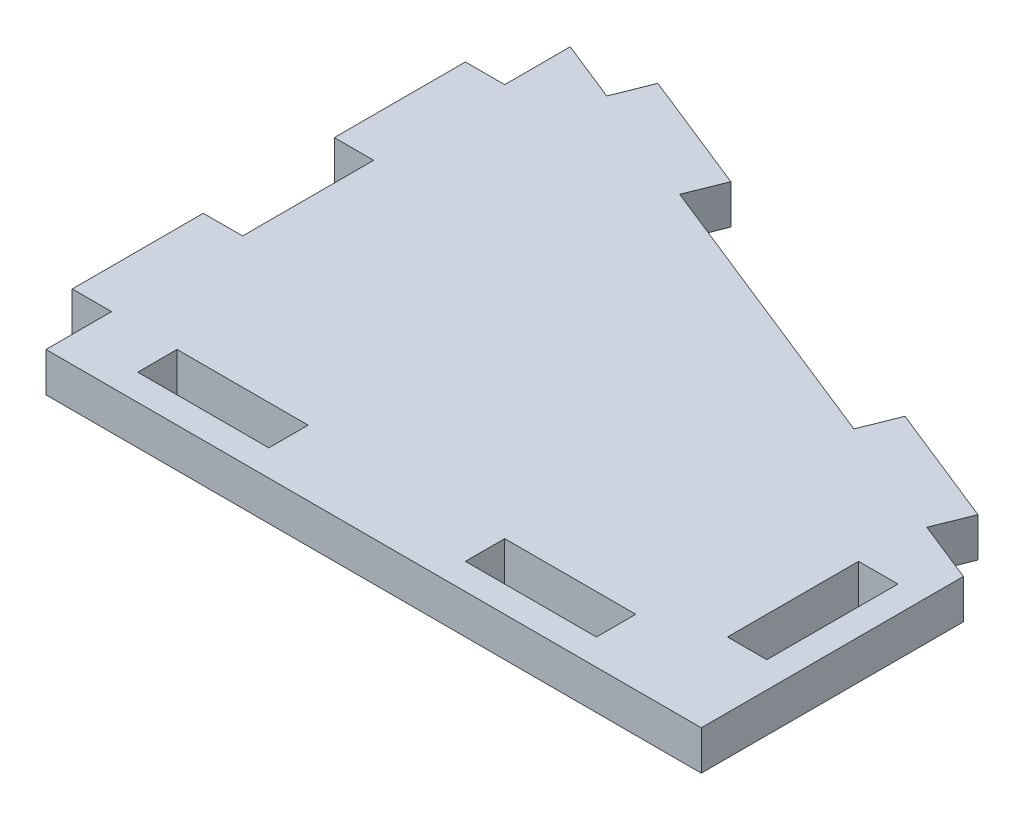
ISO-10303-21;
HEADER;
FILE_DESCRIPTION(('STEP AP214'),'2;1');
FILE_NAME('part.step','',(''),(''),'','','');
FILE_SCHEMA(('AUTOMOTIVE_DESIGN { 1 0 10303 214 1 1 1 1 }'));
ENDSEC;
DATA;
#1=APPLICATION_CONTEXT('core data for automotive mechanical design processes');
#2=APPLICATION_PROTOCOL_DEFINITION('international standard','automotive_design',2000,#1);
#3=PRODUCT_CONTEXT('',#1,'mechanical');
#4=PRODUCT('Part','Part','',(#3));
#5=PRODUCT_RELATED_PRODUCT_CATEGORY('part','',(#4));
#6=PRODUCT_DEFINITION_FORMATION('','',#4);
#7=PRODUCT_DEFINITION_CONTEXT('part definition',#1,'design');
#8=PRODUCT_DEFINITION('design','',#6,#7);
#9=PRODUCT_DEFINITION_SHAPE('','',#8);
#10=(LENGTH_UNIT() NAMED_UNIT(*) SI_UNIT(.MILLI.,.METRE.));
#11=(NAMED_UNIT(*) PLANE_ANGLE_UNIT() SI_UNIT($,.RADIAN.));
#12=(NAMED_UNIT(*) SI_UNIT($,.STERADIAN.) SOLID_ANGLE_UNIT());
#13=UNCERTAINTY_MEASURE_WITH_UNIT(LENGTH_MEASURE(1.E-05),#10,'distance_accuracy_value','');
#14=(GEOMETRIC_REPRESENTATION_CONTEXT(3) GLOBAL_UNCERTAINTY_ASSIGNED_CONTEXT((#13)) GLOBAL_UNIT_ASSIGNED_CONTEXT((#10,
#11,#12)) REPRESENTATION_CONTEXT('',''));
#15=CARTESIAN_POINT('',(0.,0.,0.));
#16=DIRECTION('',(0.,0.,1.));
#17=DIRECTION('',(1.,0.,0.));
#18=AXIS2_PLACEMENT_3D('',#15,#16,#17);
#19=CARTESIAN_POINT('',(0.,3.,0.));
#20=DIRECTION('',(0.,-1.,0.));
#21=DIRECTION('',(0.,0.,-1.));
#22=AXIS2_PLACEMENT_3D('',#19,#20,#21);
#23=PLANE('',#22);
#24=DIRECTION('',(0.,0.,1.));
#25=VECTOR('',#24,1.);
#26=CARTESIAN_POINT('',(30.,3.,-5.));
#27=LINE('',#26,#25);
#28=CARTESIAN_POINT('',(30.,3.,-5.));
#29=VERTEX_POINT('',#28);
#30=CARTESIAN_POINT('',(30.,3.,-2.));
#31=VERTEX_POINT('',#30);
#32=EDGE_CURVE('E278',#29,#31,#27,.T.);
#33=ORIENTED_EDGE('',*,*,#32,.F.);
#34=DIRECTION('',(-1.,0.,0.));
#35=VECTOR('',#34,1.);
#36=CARTESIAN_POINT('',(30.,3.,-5.));
#37=LINE('',#36,#35);
#38=CARTESIAN_POINT('',(40.,3.,-5.));
#39=VERTEX_POINT('',#38);
#40=EDGE_CURVE('E286',#39,#29,#37,.T.);
#41=ORIENTED_EDGE('',*,*,#40,.F.);
#42=DIRECTION('',(0.,0.,-1.));
#43=VECTOR('',#42,1.);
#44=CARTESIAN_POINT('',(40.,3.,-5.));
#45=LINE('',#44,#43);
#46=CARTESIAN_POINT('',(40.,3.,-2.));
#47=VERTEX_POINT('',#46);
#48=EDGE_CURVE('E283',#47,#39,#45,.T.);
#49=ORIENTED_EDGE('',*,*,#48,.F.);
#50=DIRECTION('',(1.,0.,0.));
#51=VECTOR('',#50,1.);
#52=CARTESIAN_POINT('',(30.,3.,-2.));
#53=LINE('',#52,#51);
#54=EDGE_CURVE('E280',#31,#47,#53,.T.);
#55=ORIENTED_EDGE('',*,*,#54,.F.);
#56=EDGE_LOOP('',(#33,#41,#49,#55));
#57=FACE_BOUND('',#56,.T.);
#58=DIRECTION('',(1.,0.,0.));
#59=VECTOR('',#58,1.);
#60=CARTESIAN_POINT('',(50.,3.,0.));
#61=LINE('',#60,#59);
#62=CARTESIAN_POINT('',(0.,3.,0.));
#63=VERTEX_POINT('',#62);
#64=CARTESIAN_POINT('',(50.,3.,0.));
#65=VERTEX_POINT('',#64);
#66=EDGE_CURVE('E340',#63,#65,#61,.T.);
#67=ORIENTED_EDGE('',*,*,#66,.T.);
#68=DIRECTION('',(0.,0.,-1.));
#69=VECTOR('',#68,1.);
#70=CARTESIAN_POINT('',(50.,3.,-20.));
#71=LINE('',#70,#69);
#72=CARTESIAN_POINT('',(50.,3.,-20.));
#73=VERTEX_POINT('',#72);
#74=EDGE_CURVE('E343',#65,#73,#71,.T.);
#75=ORIENTED_EDGE('',*,*,#74,.T.);
#76=DIRECTION('',(-0.92847669088526,0.,-0.371390676354103));
#77=VECTOR('',#76,1.);
#78=CARTESIAN_POINT('',(45.3576165455737,3.,-21.8569533817705));
#79=LINE('',#78,#77);
#80=CARTESIAN_POINT('',(45.3576165455737,3.,-21.8569533817705));
#81=VERTEX_POINT('',#80);
#82=EDGE_CURVE('E346',#73,#81,#79,.T.);
#83=ORIENTED_EDGE('',*,*,#82,.T.);
#84=DIRECTION('',(0.371390676354104,0.,-0.928476690885259));
#85=VECTOR('',#84,1.);
#86=CARTESIAN_POINT('',(46.471788574636,3.,-24.6423834544263));
#87=LINE('',#86,#85);
#88=CARTESIAN_POINT('',(46.471788574636,3.,-24.6423834544263));
#89=VERTEX_POINT('',#88);
#90=EDGE_CURVE('E348',#81,#89,#87,.T.);
#91=ORIENTED_EDGE('',*,*,#90,.T.);
#92=DIRECTION('',(-0.928476690885259,0.,-0.371390676354104));
#93=VECTOR('',#92,1.);
#94=CARTESIAN_POINT('',(37.1870216657834,3.,-28.3562902179673));
#95=LINE('',#94,#93);
#96=CARTESIAN_POINT('',(37.1870216657834,3.,-28.3562902179673));
#97=VERTEX_POINT('',#96);
#98=EDGE_CURVE('E350',#89,#97,#95,.T.);
#99=ORIENTED_EDGE('',*,*,#98,.T.);
#100=DIRECTION('',(-0.371390676354106,0.,0.928476690885259));
#101=VECTOR('',#100,1.);
#102=CARTESIAN_POINT('',(36.0728496367211,3.,-25.5708601453116));
#103=LINE('',#102,#101);
#104=CARTESIAN_POINT('',(36.0728496367211,3.,-25.5708601453116));
#105=VERTEX_POINT('',#104);
#106=EDGE_CURVE('E352',#97,#105,#103,.T.);
#107=ORIENTED_EDGE('',*,*,#106,.T.);
#108=DIRECTION('',(-0.928476690885259,0.,-0.371390676354104));
#109=VECTOR('',#108,1.);
#110=CARTESIAN_POINT('',(13.9271503632789,3.,-34.4291398546884));
#111=LINE('',#110,#109);
#112=CARTESIAN_POINT('',(13.9271503632789,3.,-34.4291398546884));
#113=VERTEX_POINT('',#112);
#114=EDGE_CURVE('E354',#105,#113,#111,.T.);
#115=ORIENTED_EDGE('',*,*,#114,.T.);
#116=DIRECTION('',(0.371390676354104,0.,-0.928476690885259));
#117=VECTOR('',#116,1.);
#118=CARTESIAN_POINT('',(15.0413223923412,3.,-37.2145699273442));
#119=LINE('',#118,#117);
#120=CARTESIAN_POINT('',(15.0413223923412,3.,-37.2145699273442));
#121=VERTEX_POINT('',#120);
#122=EDGE_CURVE('E356',#113,#121,#119,.T.);
#123=ORIENTED_EDGE('',*,*,#122,.T.);
#124=DIRECTION('',(-0.928476690885259,0.,-0.371390676354104));
#125=VECTOR('',#124,1.);
#126=CARTESIAN_POINT('',(5.75655548348861,3.,-40.9284766908853));
#127=LINE('',#126,#125);
#128=CARTESIAN_POINT('',(5.75655548348861,3.,-40.9284766908853));
#129=VERTEX_POINT('',#128);
#130=EDGE_CURVE('E358',#121,#129,#127,.T.);
#131=ORIENTED_EDGE('',*,*,#130,.T.);
#132=DIRECTION('',(-0.371390676354104,0.,0.928476690885259));
#133=VECTOR('',#132,1.);
#134=CARTESIAN_POINT('',(4.6423834544263,3.,-38.1430466182295));
#135=LINE('',#134,#133);
#136=CARTESIAN_POINT('',(4.6423834544263,3.,-38.1430466182295));
#137=VERTEX_POINT('',#136);
#138=EDGE_CURVE('E360',#129,#137,#135,.T.);
#139=ORIENTED_EDGE('',*,*,#138,.T.);
#140=DIRECTION('',(-0.928476690885259,0.,-0.371390676354104));
#141=VECTOR('',#140,1.);
#142=CARTESIAN_POINT('',(0.,3.,-40.));
#143=LINE('',#142,#141);
#144=CARTESIAN_POINT('',(0.,3.,-40.));
#145=VERTEX_POINT('',#144);
#146=EDGE_CURVE('E362',#137,#145,#143,.T.);
#147=ORIENTED_EDGE('',*,*,#146,.T.);
#148=DIRECTION('',(0.,0.,1.));
#149=VECTOR('',#148,1.);
#150=CARTESIAN_POINT('',(0.,3.,-35.));
#151=LINE('',#150,#149);
#152=CARTESIAN_POINT('',(0.,3.,-35.));
#153=VERTEX_POINT('',#152);
#154=EDGE_CURVE('E364',#145,#153,#151,.T.);
#155=ORIENTED_EDGE('',*,*,#154,.T.);
#156=DIRECTION('',(-1.,0.,0.));
#157=VECTOR('',#156,1.);
#158=CARTESIAN_POINT('',(0.,3.,-35.));
#159=LINE('',#158,#157);
#160=CARTESIAN_POINT('',(-3.,3.,-35.));
#161=VERTEX_POINT('',#160);
#162=EDGE_CURVE('E366',#153,#161,#159,.T.);
#163=ORIENTED_EDGE('',*,*,#162,.T.);
#164=DIRECTION('',(0.,0.,1.));
#165=VECTOR('',#164,1.);
#166=CARTESIAN_POINT('',(-3.,3.,-25.));
#167=LINE('',#166,#165);
#168=CARTESIAN_POINT('',(-3.,3.,-25.));
#169=VERTEX_POINT('',#168);
#170=EDGE_CURVE('E368',#161,#169,#167,.T.);
#171=ORIENTED_EDGE('',*,*,#170,.T.);
#172=DIRECTION('',(1.,0.,0.));
#173=VECTOR('',#172,1.);
#174=CARTESIAN_POINT('',(0.,3.,-25.));
#175=LINE('',#174,#173);
#176=CARTESIAN_POINT('',(0.,3.,-25.));
#177=VERTEX_POINT('',#176);
#178=EDGE_CURVE('E370',#169,#177,#175,.T.);
#179=ORIENTED_EDGE('',*,*,#178,.T.);
#180=DIRECTION('',(0.,0.,1.));
#181=VECTOR('',#180,1.);
#182=CARTESIAN_POINT('',(0.,3.,-15.));
#183=LINE('',#182,#181);
#184=CARTESIAN_POINT('',(0.,3.,-15.));
#185=VERTEX_POINT('',#184);
#186=EDGE_CURVE('E372',#177,#185,#183,.T.);
#187=ORIENTED_EDGE('',*,*,#186,.T.);
#188=DIRECTION('',(-1.,0.,0.));
#189=VECTOR('',#188,1.);
#190=CARTESIAN_POINT('',(0.,3.,-15.));
#191=LINE('',#190,#189);
#192=CARTESIAN_POINT('',(-3.,3.,-15.));
#193=VERTEX_POINT('',#192);
#194=EDGE_CURVE('E374',#185,#193,#191,.T.);
#195=ORIENTED_EDGE('',*,*,#194,.T.);
#196=DIRECTION('',(0.,0.,1.));
#197=VECTOR('',#196,1.);
#198=CARTESIAN_POINT('',(-3.,3.,-15.));
#199=LINE('',#198,#197);
#200=CARTESIAN_POINT('',(-3.,3.,-4.99999999999999));
#201=VERTEX_POINT('',#200);
#202=EDGE_CURVE('E376',#193,#201,#199,.T.);
#203=ORIENTED_EDGE('',*,*,#202,.T.);
#204=DIRECTION('',(1.,0.,0.));
#205=VECTOR('',#204,1.);
#206=CARTESIAN_POINT('',(0.,3.,-4.99999999999999));
#207=LINE('',#206,#205);
#208=CARTESIAN_POINT('',(0.,3.,-4.99999999999999));
#209=VERTEX_POINT('',#208);
#210=EDGE_CURVE('E378',#201,#209,#207,.T.);
#211=ORIENTED_EDGE('',*,*,#210,.T.);
#212=DIRECTION('',(0.,0.,1.));
#213=VECTOR('',#212,1.);
#214=CARTESIAN_POINT('',(0.,3.,0.));
#215=LINE('',#214,#213);
#216=EDGE_CURVE('E380',#209,#63,#215,.T.);
#217=ORIENTED_EDGE('',*,*,#216,.T.);
#218=EDGE_LOOP('',(#67,#75,#83,#91,#99,#107,#115,#123,#131,#139,#147,#155,#163,#171,#179,#187,
#195,#203,#211,#217));
#219=FACE_BOUND('',#218,.T.);
#220=DIRECTION('',(0.,0.,1.));
#221=VECTOR('',#220,1.);
#222=CARTESIAN_POINT('',(5.,3.,-4.99999999999999));
#223=LINE('',#222,#221);
#224=CARTESIAN_POINT('',(5.,3.,-4.99999999999999));
#225=VERTEX_POINT('',#224);
#226=CARTESIAN_POINT('',(5.,3.,-1.99999999999999));
#227=VERTEX_POINT('',#226);
#228=EDGE_CURVE('E309',#225,#227,#223,.T.);
#229=ORIENTED_EDGE('',*,*,#228,.F.);
#230=DIRECTION('',(-1.,0.,0.));
#231=VECTOR('',#230,1.);
#232=CARTESIAN_POINT('',(5.,3.,-4.99999999999999));
#233=LINE('',#232,#231);
#234=CARTESIAN_POINT('',(15.,3.,-4.99999999999999));
#235=VERTEX_POINT('',#234);
#236=EDGE_CURVE('E317',#235,#225,#233,.T.);
#237=ORIENTED_EDGE('',*,*,#236,.F.);
#238=DIRECTION('',(0.,0.,-1.));
#239=VECTOR('',#238,1.);
#240=CARTESIAN_POINT('',(15.,3.,-4.99999999999999));
#241=LINE('',#240,#239);
#242=CARTESIAN_POINT('',(15.,3.,-1.99999999999999));
#243=VERTEX_POINT('',#242);
#244=EDGE_CURVE('E314',#243,#235,#241,.T.);
#245=ORIENTED_EDGE('',*,*,#244,.F.);
#246=DIRECTION('',(1.,0.,0.));
#247=VECTOR('',#246,1.);
#248=CARTESIAN_POINT('',(5.,3.,-1.99999999999999));
#249=LINE('',#248,#247);
#250=EDGE_CURVE('E311',#227,#243,#249,.T.);
#251=ORIENTED_EDGE('',*,*,#250,.F.);
#252=EDGE_LOOP('',(#229,#237,#245,#251));
#253=FACE_BOUND('',#252,.T.);
#254=DIRECTION('',(0.,0.,1.));
#255=VECTOR('',#254,1.);
#256=CARTESIAN_POINT('',(45.,3.,-17.));
#257=LINE('',#256,#255);
#258=CARTESIAN_POINT('',(45.,3.,-17.));
#259=VERTEX_POINT('',#258);
#260=CARTESIAN_POINT('',(45.,3.,-7.00000000000001));
#261=VERTEX_POINT('',#260);
#262=EDGE_CURVE('E242',#259,#261,#257,.T.);
#263=ORIENTED_EDGE('',*,*,#262,.F.);
#264=DIRECTION('',(-1.,0.,0.));
#265=VECTOR('',#264,1.);
#266=CARTESIAN_POINT('',(45.,3.,-17.));
#267=LINE('',#266,#265);
#268=CARTESIAN_POINT('',(48.,3.,-17.));
#269=VERTEX_POINT('',#268);
#270=EDGE_CURVE('E264',#269,#259,#267,.T.);
#271=ORIENTED_EDGE('',*,*,#270,.F.);
#272=DIRECTION('',(0.,0.,-1.));
#273=VECTOR('',#272,1.);
#274=CARTESIAN_POINT('',(48.,3.,-17.));
#275=LINE('',#274,#273);
#276=CARTESIAN_POINT('',(48.,3.,-7.00000000000001));
#277=VERTEX_POINT('',#276);
#278=EDGE_CURVE('E262',#277,#269,#275,.T.);
#279=ORIENTED_EDGE('',*,*,#278,.F.);
#280=DIRECTION('',(1.,0.,0.));
#281=VECTOR('',#280,1.);
#282=CARTESIAN_POINT('',(45.,3.,-7.00000000000001));
#283=LINE('',#282,#281);
#284=EDGE_CURVE('E250',#261,#277,#283,.T.);
#285=ORIENTED_EDGE('',*,*,#284,.F.);
#286=EDGE_LOOP('',(#263,#271,#279,#285));
#287=FACE_BOUND('',#286,.T.);
#288=ADVANCED_FACE('F33',(#57,#219,#253,#287),#23,.F.);
#289=CARTESIAN_POINT('',(0.,0.,0.));
#290=DIRECTION('',(0.,-1.,0.));
#291=DIRECTION('',(0.,0.,-1.));
#292=AXIS2_PLACEMENT_3D('',#289,#290,#291);
#293=PLANE('',#292);
#294=DIRECTION('',(1.,0.,0.));
#295=VECTOR('',#294,1.);
#296=CARTESIAN_POINT('',(50.,0.,0.));
#297=LINE('',#296,#295);
#298=CARTESIAN_POINT('',(0.,0.,0.));
#299=VERTEX_POINT('',#298);
#300=CARTESIAN_POINT('',(50.,0.,0.));
#301=VERTEX_POINT('',#300);
#302=EDGE_CURVE('E339',#299,#301,#297,.T.);
#303=ORIENTED_EDGE('',*,*,#302,.F.);
#304=DIRECTION('',(0.,0.,1.));
#305=VECTOR('',#304,1.);
#306=CARTESIAN_POINT('',(0.,0.,0.));
#307=LINE('',#306,#305);
#308=CARTESIAN_POINT('',(0.,0.,-4.99999999999999));
#309=VERTEX_POINT('',#308);
#310=EDGE_CURVE('E344',#309,#299,#307,.T.);
#311=ORIENTED_EDGE('',*,*,#310,.F.);
#312=DIRECTION('',(1.,0.,0.));
#313=VECTOR('',#312,1.);
#314=CARTESIAN_POINT('',(0.,0.,-4.99999999999999));
#315=LINE('',#314,#313);
#316=CARTESIAN_POINT('',(-3.,0.,-4.99999999999999));
#317=VERTEX_POINT('',#316);
#318=EDGE_CURVE('E419',#317,#309,#315,.T.);
#319=ORIENTED_EDGE('',*,*,#318,.F.);
#320=DIRECTION('',(0.,0.,1.));
#321=VECTOR('',#320,1.);
#322=CARTESIAN_POINT('',(-3.,0.,-15.));
#323=LINE('',#322,#321);
#324=CARTESIAN_POINT('',(-3.,0.,-15.));
#325=VERTEX_POINT('',#324);
#326=EDGE_CURVE('E417',#325,#317,#323,.T.);
#327=ORIENTED_EDGE('',*,*,#326,.F.);
#328=DIRECTION('',(-1.,0.,0.));
#329=VECTOR('',#328,1.);
#330=CARTESIAN_POINT('',(0.,0.,-15.));
#331=LINE('',#330,#329);
#332=CARTESIAN_POINT('',(0.,0.,-15.));
#333=VERTEX_POINT('',#332);
#334=EDGE_CURVE('E415',#333,#325,#331,.T.);
#335=ORIENTED_EDGE('',*,*,#334,.F.);
#336=DIRECTION('',(0.,0.,1.));
#337=VECTOR('',#336,1.);
#338=CARTESIAN_POINT('',(0.,0.,-15.));
#339=LINE('',#338,#337);
#340=CARTESIAN_POINT('',(0.,0.,-25.));
#341=VERTEX_POINT('',#340);
#342=EDGE_CURVE('E413',#341,#333,#339,.T.);
#343=ORIENTED_EDGE('',*,*,#342,.F.);
#344=DIRECTION('',(1.,0.,0.));
#345=VECTOR('',#344,1.);
#346=CARTESIAN_POINT('',(0.,0.,-25.));
#347=LINE('',#346,#345);
#348=CARTESIAN_POINT('',(-3.,0.,-25.));
#349=VERTEX_POINT('',#348);
#350=EDGE_CURVE('E411',#349,#341,#347,.T.);
#351=ORIENTED_EDGE('',*,*,#350,.F.);
#352=DIRECTION('',(0.,0.,1.));
#353=VECTOR('',#352,1.);
#354=CARTESIAN_POINT('',(-3.,0.,-25.));
#355=LINE('',#354,#353);
#356=CARTESIAN_POINT('',(-3.,0.,-35.));
#357=VERTEX_POINT('',#356);
#358=EDGE_CURVE('E409',#357,#349,#355,.T.);
#359=ORIENTED_EDGE('',*,*,#358,.F.);
#360=DIRECTION('',(-1.,0.,0.));
#361=VECTOR('',#360,1.);
#362=CARTESIAN_POINT('',(0.,0.,-35.));
#363=LINE('',#362,#361);
#364=CARTESIAN_POINT('',(0.,0.,-35.));
#365=VERTEX_POINT('',#364);
#366=EDGE_CURVE('E407',#365,#357,#363,.T.);
#367=ORIENTED_EDGE('',*,*,#366,.F.);
#368=DIRECTION('',(0.,0.,1.));
#369=VECTOR('',#368,1.);
#370=CARTESIAN_POINT('',(0.,0.,-35.));
#371=LINE('',#370,#369);
#372=CARTESIAN_POINT('',(0.,0.,-40.));
#373=VERTEX_POINT('',#372);
#374=EDGE_CURVE('E405',#373,#365,#371,.T.);
#375=ORIENTED_EDGE('',*,*,#374,.F.);
#376=DIRECTION('',(-0.928476690885259,0.,-0.371390676354104));
#377=VECTOR('',#376,1.);
#378=CARTESIAN_POINT('',(0.,0.,-40.));
#379=LINE('',#378,#377);
#380=CARTESIAN_POINT('',(4.6423834544263,0.,-38.1430466182295));
#381=VERTEX_POINT('',#380);
#382=EDGE_CURVE('E403',#381,#373,#379,.T.);
#383=ORIENTED_EDGE('',*,*,#382,.F.);
#384=DIRECTION('',(-0.371390676354104,0.,0.928476690885259));
#385=VECTOR('',#384,1.);
#386=CARTESIAN_POINT('',(4.6423834544263,0.,-38.1430466182295));
#387=LINE('',#386,#385);
#388=CARTESIAN_POINT('',(5.75655548348861,0.,-40.9284766908853));
#389=VERTEX_POINT('',#388);
#390=EDGE_CURVE('E401',#389,#381,#387,.T.);
#391=ORIENTED_EDGE('',*,*,#390,.F.);
#392=DIRECTION('',(-0.928476690885259,0.,-0.371390676354104));
#393=VECTOR('',#392,1.);
#394=CARTESIAN_POINT('',(5.75655548348861,0.,-40.9284766908853));
#395=LINE('',#394,#393);
#396=CARTESIAN_POINT('',(15.0413223923412,0.,-37.2145699273442));
#397=VERTEX_POINT('',#396);
#398=EDGE_CURVE('E399',#397,#389,#395,.T.);
#399=ORIENTED_EDGE('',*,*,#398,.F.);
#400=DIRECTION('',(0.371390676354104,0.,-0.928476690885259));
#401=VECTOR('',#400,1.);
#402=CARTESIAN_POINT('',(15.0413223923412,0.,-37.2145699273442));
#403=LINE('',#402,#401);
#404=CARTESIAN_POINT('',(13.9271503632789,0.,-34.4291398546884));
#405=VERTEX_POINT('',#404);
#406=EDGE_CURVE('E397',#405,#397,#403,.T.);
#407=ORIENTED_EDGE('',*,*,#406,.F.);
#408=DIRECTION('',(-0.928476690885259,0.,-0.371390676354104));
#409=VECTOR('',#408,1.);
#410=CARTESIAN_POINT('',(13.9271503632789,0.,-34.4291398546884));
#411=LINE('',#410,#409);
#412=CARTESIAN_POINT('',(36.0728496367211,0.,-25.5708601453116));
#413=VERTEX_POINT('',#412);
#414=EDGE_CURVE('E395',#413,#405,#411,.T.);
#415=ORIENTED_EDGE('',*,*,#414,.F.);
#416=DIRECTION('',(-0.371390676354106,0.,0.928476690885259));
#417=VECTOR('',#416,1.);
#418=CARTESIAN_POINT('',(36.0728496367211,0.,-25.5708601453116));
#419=LINE('',#418,#417);
#420=CARTESIAN_POINT('',(37.1870216657834,0.,-28.3562902179673));
#421=VERTEX_POINT('',#420);
#422=EDGE_CURVE('E393',#421,#413,#419,.T.);
#423=ORIENTED_EDGE('',*,*,#422,.F.);
#424=DIRECTION('',(-0.928476690885259,0.,-0.371390676354104));
#425=VECTOR('',#424,1.);
#426=CARTESIAN_POINT('',(37.1870216657834,0.,-28.3562902179673));
#427=LINE('',#426,#425);
#428=CARTESIAN_POINT('',(46.471788574636,0.,-24.6423834544263));
#429=VERTEX_POINT('',#428);
#430=EDGE_CURVE('E391',#429,#421,#427,.T.);
#431=ORIENTED_EDGE('',*,*,#430,.F.);
#432=DIRECTION('',(0.371390676354104,0.,-0.928476690885259));
#433=VECTOR('',#432,1.);
#434=CARTESIAN_POINT('',(46.471788574636,0.,-24.6423834544263));
#435=LINE('',#434,#433);
#436=CARTESIAN_POINT('',(45.3576165455737,0.,-21.8569533817705));
#437=VERTEX_POINT('',#436);
#438=EDGE_CURVE('E389',#437,#429,#435,.T.);
#439=ORIENTED_EDGE('',*,*,#438,.F.);
#440=DIRECTION('',(-0.92847669088526,0.,-0.371390676354103));
#441=VECTOR('',#440,1.);
#442=CARTESIAN_POINT('',(45.3576165455737,0.,-21.8569533817705));
#443=LINE('',#442,#441);
#444=CARTESIAN_POINT('',(50.,0.,-20.));
#445=VERTEX_POINT('',#444);
#446=EDGE_CURVE('E387',#445,#437,#443,.T.);
#447=ORIENTED_EDGE('',*,*,#446,.F.);
#448=DIRECTION('',(0.,0.,-1.));
#449=VECTOR('',#448,1.);
#450=CARTESIAN_POINT('',(50.,0.,-20.));
#451=LINE('',#450,#449);
#452=EDGE_CURVE('E385',#301,#445,#451,.T.);
#453=ORIENTED_EDGE('',*,*,#452,.F.);
#454=EDGE_LOOP('',(#303,#311,#319,#327,#335,#343,#351,#359,#367,#375,#383,#391,#399,#407,#415,
#423,#431,#439,#447,#453));
#455=FACE_BOUND('',#454,.T.);
#456=DIRECTION('',(-1.,0.,0.));
#457=VECTOR('',#456,1.);
#458=CARTESIAN_POINT('',(5.,0.,-4.99999999999999));
#459=LINE('',#458,#457);
#460=CARTESIAN_POINT('',(15.,0.,-4.99999999999999));
#461=VERTEX_POINT('',#460);
#462=CARTESIAN_POINT('',(5.,0.,-4.99999999999999));
#463=VERTEX_POINT('',#462);
#464=EDGE_CURVE('E312',#461,#463,#459,.T.);
#465=ORIENTED_EDGE('',*,*,#464,.T.);
#466=DIRECTION('',(0.,0.,1.));
#467=VECTOR('',#466,1.);
#468=CARTESIAN_POINT('',(5.,0.,-4.99999999999999));
#469=LINE('',#468,#467);
#470=CARTESIAN_POINT('',(5.,0.,-1.99999999999999));
#471=VERTEX_POINT('',#470);
#472=EDGE_CURVE('E308',#463,#471,#469,.T.);
#473=ORIENTED_EDGE('',*,*,#472,.T.);
#474=DIRECTION('',(1.,0.,0.));
#475=VECTOR('',#474,1.);
#476=CARTESIAN_POINT('',(5.,0.,-1.99999999999999));
#477=LINE('',#476,#475);
#478=CARTESIAN_POINT('',(15.,0.,-1.99999999999999));
#479=VERTEX_POINT('',#478);
#480=EDGE_CURVE('E322',#471,#479,#477,.T.);
#481=ORIENTED_EDGE('',*,*,#480,.T.);
#482=DIRECTION('',(0.,0.,-1.));
#483=VECTOR('',#482,1.);
#484=CARTESIAN_POINT('',(15.,0.,-4.99999999999999));
#485=LINE('',#484,#483);
#486=EDGE_CURVE('E325',#479,#461,#485,.T.);
#487=ORIENTED_EDGE('',*,*,#486,.T.);
#488=EDGE_LOOP('',(#465,#473,#481,#487));
#489=FACE_BOUND('',#488,.T.);
#490=DIRECTION('',(-1.,0.,0.));
#491=VECTOR('',#490,1.);
#492=CARTESIAN_POINT('',(30.,0.,-5.));
#493=LINE('',#492,#491);
#494=CARTESIAN_POINT('',(40.,0.,-5.));
#495=VERTEX_POINT('',#494);
#496=CARTESIAN_POINT('',(30.,0.,-5.));
#497=VERTEX_POINT('',#496);
#498=EDGE_CURVE('E281',#495,#497,#493,.T.);
#499=ORIENTED_EDGE('',*,*,#498,.T.);
#500=DIRECTION('',(0.,0.,1.));
#501=VECTOR('',#500,1.);
#502=CARTESIAN_POINT('',(30.,0.,-5.));
#503=LINE('',#502,#501);
#504=CARTESIAN_POINT('',(30.,0.,-2.));
#505=VERTEX_POINT('',#504);
#506=EDGE_CURVE('E258',#497,#505,#503,.T.);
#507=ORIENTED_EDGE('',*,*,#506,.T.);
#508=DIRECTION('',(1.,0.,0.));
#509=VECTOR('',#508,1.);
#510=CARTESIAN_POINT('',(30.,0.,-2.));
#511=LINE('',#510,#509);
#512=CARTESIAN_POINT('',(40.,0.,-2.));
#513=VERTEX_POINT('',#512);
#514=EDGE_CURVE('E291',#505,#513,#511,.T.);
#515=ORIENTED_EDGE('',*,*,#514,.T.);
#516=DIRECTION('',(0.,0.,-1.));
#517=VECTOR('',#516,1.);
#518=CARTESIAN_POINT('',(40.,0.,-5.));
#519=LINE('',#518,#517);
#520=EDGE_CURVE('E294',#513,#495,#519,.T.);
#521=ORIENTED_EDGE('',*,*,#520,.T.);
#522=EDGE_LOOP('',(#499,#507,#515,#521));
#523=FACE_BOUND('',#522,.T.);
#524=DIRECTION('',(-1.,0.,0.));
#525=VECTOR('',#524,1.);
#526=CARTESIAN_POINT('',(45.,0.,-17.));
#527=LINE('',#526,#525);
#528=CARTESIAN_POINT('',(48.,0.,-17.));
#529=VERTEX_POINT('',#528);
#530=CARTESIAN_POINT('',(45.,0.,-17.));
#531=VERTEX_POINT('',#530);
#532=EDGE_CURVE('E251',#529,#531,#527,.T.);
#533=ORIENTED_EDGE('',*,*,#532,.T.);
#534=DIRECTION('',(0.,0.,1.));
#535=VECTOR('',#534,1.);
#536=CARTESIAN_POINT('',(45.,0.,-17.));
#537=LINE('',#536,#535);
#538=CARTESIAN_POINT('',(45.,0.,-7.00000000000001));
#539=VERTEX_POINT('',#538);
#540=EDGE_CURVE('E56',#531,#539,#537,.T.);
#541=ORIENTED_EDGE('',*,*,#540,.T.);
#542=DIRECTION('',(1.,0.,0.));
#543=VECTOR('',#542,1.);
#544=CARTESIAN_POINT('',(45.,0.,-7.00000000000001));
#545=LINE('',#544,#543);
#546=CARTESIAN_POINT('',(48.,0.,-7.00000000000001));
#547=VERTEX_POINT('',#546);
#548=EDGE_CURVE('E257',#539,#547,#545,.T.);
#549=ORIENTED_EDGE('',*,*,#548,.T.);
#550=DIRECTION('',(0.,0.,-1.));
#551=VECTOR('',#550,1.);
#552=CARTESIAN_POINT('',(48.,0.,-17.));
#553=LINE('',#552,#551);
#554=EDGE_CURVE('E270',#547,#529,#553,.T.);
#555=ORIENTED_EDGE('',*,*,#554,.T.);
#556=EDGE_LOOP('',(#533,#541,#549,#555));
#557=FACE_BOUND('',#556,.T.);
#558=ADVANCED_FACE('F485',(#455,#489,#523,#557),#293,.T.);
#559=CARTESIAN_POINT('',(50.,3.,0.));
#560=DIRECTION('',(0.,0.,-1.));
#561=DIRECTION('',(-1.,0.,0.));
#562=AXIS2_PLACEMENT_3D('',#559,#560,#561);
#563=PLANE('',#562);
#564=ORIENTED_EDGE('',*,*,#302,.T.);
#565=DIRECTION('',(0.,-1.,0.));
#566=VECTOR('',#565,1.);
#567=CARTESIAN_POINT('',(50.,3.,0.));
#568=LINE('',#567,#566);
#569=EDGE_CURVE('E11',#65,#301,#568,.T.);
#570=ORIENTED_EDGE('',*,*,#569,.F.);
#571=ORIENTED_EDGE('',*,*,#66,.F.);
#572=DIRECTION('',(0.,-1.,0.));
#573=VECTOR('',#572,1.);
#574=CARTESIAN_POINT('',(0.,3.,0.));
#575=LINE('',#574,#573);
#576=EDGE_CURVE('E382',#63,#299,#575,.T.);
#577=ORIENTED_EDGE('',*,*,#576,.T.);
#578=EDGE_LOOP('',(#564,#570,#571,#577));
#579=FACE_BOUND('',#578,.T.);
#580=ADVANCED_FACE('F35',(#579),#563,.F.);
#581=CARTESIAN_POINT('',(50.,3.,-20.));
#582=DIRECTION('',(-1.,0.,0.));
#583=DIRECTION('',(0.,0.,1.));
#584=AXIS2_PLACEMENT_3D('',#581,#582,#583);
#585=PLANE('',#584);
#586=ORIENTED_EDGE('',*,*,#452,.T.);
#587=DIRECTION('',(0.,-1.,0.));
#588=VECTOR('',#587,1.);
#589=CARTESIAN_POINT('',(50.,3.,-20.));
#590=LINE('',#589,#588);
#591=EDGE_CURVE('E41',#73,#445,#590,.T.);
#592=ORIENTED_EDGE('',*,*,#591,.F.);
#593=ORIENTED_EDGE('',*,*,#74,.F.);
#594=ORIENTED_EDGE('',*,*,#569,.T.);
#595=EDGE_LOOP('',(#586,#592,#593,#594));
#596=FACE_BOUND('',#595,.T.);
#597=ADVANCED_FACE('F503',(#596),#585,.F.);
#598=CARTESIAN_POINT('',(45.3576165455737,3.,-21.8569533817705));
#599=DIRECTION('',(-0.371390676354103,0.,0.928476690885259));
#600=DIRECTION('',(0.928476690885259,0.,0.371390676354103));
#601=AXIS2_PLACEMENT_3D('',#598,#599,#600);
#602=PLANE('',#601);
#603=ORIENTED_EDGE('',*,*,#446,.T.);
#604=DIRECTION('',(0.,-1.,0.));
#605=VECTOR('',#604,1.);
#606=CARTESIAN_POINT('',(45.3576165455737,3.,-21.8569533817705));
#607=LINE('',#606,#605);
#608=EDGE_CURVE('E472',#81,#437,#607,.T.);
#609=ORIENTED_EDGE('',*,*,#608,.F.);
#610=ORIENTED_EDGE('',*,*,#82,.F.);
#611=ORIENTED_EDGE('',*,*,#591,.T.);
#612=EDGE_LOOP('',(#603,#609,#610,#611));
#613=FACE_BOUND('',#612,.T.);
#614=ADVANCED_FACE('F479',(#613),#602,.F.);
#615=CARTESIAN_POINT('',(46.471788574636,3.,-24.6423834544263));
#616=DIRECTION('',(-0.928476690885259,0.,-0.371390676354104));
#617=DIRECTION('',(-0.371390676354104,0.,0.928476690885259));
#618=AXIS2_PLACEMENT_3D('',#615,#616,#617);
#619=PLANE('',#618);
#620=ORIENTED_EDGE('',*,*,#438,.T.);
#621=DIRECTION('',(0.,-1.,0.));
#622=VECTOR('',#621,1.);
#623=CARTESIAN_POINT('',(46.471788574636,3.,-24.6423834544263));
#624=LINE('',#623,#622);
#625=EDGE_CURVE('E469',#89,#429,#624,.T.);
#626=ORIENTED_EDGE('',*,*,#625,.F.);
#627=ORIENTED_EDGE('',*,*,#90,.F.);
#628=ORIENTED_EDGE('',*,*,#608,.T.);
#629=EDGE_LOOP('',(#620,#626,#627,#628));
#630=FACE_BOUND('',#629,.T.);
#631=ADVANCED_FACE('F491',(#630),#619,.F.);
#632=CARTESIAN_POINT('',(37.1870216657834,3.,-28.3562902179673));
#633=DIRECTION('',(-0.371390676354104,0.,0.928476690885259));
#634=DIRECTION('',(0.928476690885259,0.,0.371390676354104));
#635=AXIS2_PLACEMENT_3D('',#632,#633,#634);
#636=PLANE('',#635);
#637=ORIENTED_EDGE('',*,*,#430,.T.);
#638=DIRECTION('',(0.,-1.,0.));
#639=VECTOR('',#638,1.);
#640=CARTESIAN_POINT('',(37.1870216657834,3.,-28.3562902179673));
#641=LINE('',#640,#639);
#642=EDGE_CURVE('E466',#97,#421,#641,.T.);
#643=ORIENTED_EDGE('',*,*,#642,.F.);
#644=ORIENTED_EDGE('',*,*,#98,.F.);
#645=ORIENTED_EDGE('',*,*,#625,.T.);
#646=EDGE_LOOP('',(#637,#643,#644,#645));
#647=FACE_BOUND('',#646,.T.);
#648=ADVANCED_FACE('F495',(#647),#636,.F.);
#649=CARTESIAN_POINT('',(36.0728496367211,3.,-25.5708601453116));
#650=DIRECTION('',(0.928476690885259,0.,0.371390676354106));
#651=DIRECTION('',(0.371390676354106,0.,-0.928476690885259));
#652=AXIS2_PLACEMENT_3D('',#649,#650,#651);
#653=PLANE('',#652);
#654=ORIENTED_EDGE('',*,*,#422,.T.);
#655=DIRECTION('',(0.,-1.,0.));
#656=VECTOR('',#655,1.);
#657=CARTESIAN_POINT('',(36.0728496367211,3.,-25.5708601453116));
#658=LINE('',#657,#656);
#659=EDGE_CURVE('E463',#105,#413,#658,.T.);
#660=ORIENTED_EDGE('',*,*,#659,.F.);
#661=ORIENTED_EDGE('',*,*,#106,.F.);
#662=ORIENTED_EDGE('',*,*,#642,.T.);
#663=EDGE_LOOP('',(#654,#660,#661,#662));
#664=FACE_BOUND('',#663,.T.);
#665=ADVANCED_FACE('F576',(#664),#653,.F.);
#666=CARTESIAN_POINT('',(13.9271503632789,3.,-34.4291398546884));
#667=DIRECTION('',(-0.371390676354104,0.,0.928476690885259));
#668=DIRECTION('',(0.928476690885259,0.,0.371390676354104));
#669=AXIS2_PLACEMENT_3D('',#666,#667,#668);
#670=PLANE('',#669);
#671=ORIENTED_EDGE('',*,*,#414,.T.);
#672=DIRECTION('',(0.,-1.,0.));
#673=VECTOR('',#672,1.);
#674=CARTESIAN_POINT('',(13.9271503632789,3.,-34.4291398546884));
#675=LINE('',#674,#673);
#676=EDGE_CURVE('E460',#113,#405,#675,.T.);
#677=ORIENTED_EDGE('',*,*,#676,.F.);
#678=ORIENTED_EDGE('',*,*,#114,.F.);
#679=ORIENTED_EDGE('',*,*,#659,.T.);
#680=EDGE_LOOP('',(#671,#677,#678,#679));
#681=FACE_BOUND('',#680,.T.);
#682=ADVANCED_FACE('F574',(#681),#670,.F.);
#683=CARTESIAN_POINT('',(15.0413223923412,3.,-37.2145699273442));
#684=DIRECTION('',(-0.928476690885259,0.,-0.371390676354104));
#685=DIRECTION('',(-0.371390676354104,0.,0.928476690885259));
#686=AXIS2_PLACEMENT_3D('',#683,#684,#685);
#687=PLANE('',#686);
#688=ORIENTED_EDGE('',*,*,#406,.T.);
#689=DIRECTION('',(0.,-1.,0.));
#690=VECTOR('',#689,1.);
#691=CARTESIAN_POINT('',(15.0413223923412,3.,-37.2145699273442));
#692=LINE('',#691,#690);
#693=EDGE_CURVE('E457',#121,#397,#692,.T.);
#694=ORIENTED_EDGE('',*,*,#693,.F.);
#695=ORIENTED_EDGE('',*,*,#122,.F.);
#696=ORIENTED_EDGE('',*,*,#676,.T.);
#697=EDGE_LOOP('',(#688,#694,#695,#696));
#698=FACE_BOUND('',#697,.T.);
#699=ADVANCED_FACE('F569',(#698),#687,.F.);
#700=CARTESIAN_POINT('',(5.75655548348861,3.,-40.9284766908853));
#701=DIRECTION('',(-0.371390676354104,0.,0.928476690885259));
#702=DIRECTION('',(0.928476690885259,0.,0.371390676354104));
#703=AXIS2_PLACEMENT_3D('',#700,#701,#702);
#704=PLANE('',#703);
#705=ORIENTED_EDGE('',*,*,#398,.T.);
#706=DIRECTION('',(0.,-1.,0.));
#707=VECTOR('',#706,1.);
#708=CARTESIAN_POINT('',(5.75655548348861,3.,-40.9284766908853));
#709=LINE('',#708,#707);
#710=EDGE_CURVE('E454',#129,#389,#709,.T.);
#711=ORIENTED_EDGE('',*,*,#710,.F.);
#712=ORIENTED_EDGE('',*,*,#130,.F.);
#713=ORIENTED_EDGE('',*,*,#693,.T.);
#714=EDGE_LOOP('',(#705,#711,#712,#713));
#715=FACE_BOUND('',#714,.T.);
#716=ADVANCED_FACE('F564',(#715),#704,.F.);
#717=CARTESIAN_POINT('',(4.6423834544263,3.,-38.1430466182295));
#718=DIRECTION('',(0.928476690885259,0.,0.371390676354104));
#719=DIRECTION('',(0.371390676354104,0.,-0.928476690885259));
#720=AXIS2_PLACEMENT_3D('',#717,#718,#719);
#721=PLANE('',#720);
#722=ORIENTED_EDGE('',*,*,#390,.T.);
#723=DIRECTION('',(0.,-1.,0.));
#724=VECTOR('',#723,1.);
#725=CARTESIAN_POINT('',(4.6423834544263,3.,-38.1430466182295));
#726=LINE('',#725,#724);
#727=EDGE_CURVE('E451',#137,#381,#726,.T.);
#728=ORIENTED_EDGE('',*,*,#727,.F.);
#729=ORIENTED_EDGE('',*,*,#138,.F.);
#730=ORIENTED_EDGE('',*,*,#710,.T.);
#731=EDGE_LOOP('',(#722,#728,#729,#730));
#732=FACE_BOUND('',#731,.T.);
#733=ADVANCED_FACE('F560',(#732),#721,.F.);
#734=CARTESIAN_POINT('',(0.,3.,-40.));
#735=DIRECTION('',(-0.371390676354104,0.,0.928476690885259));
#736=DIRECTION('',(0.928476690885259,0.,0.371390676354104));
#737=AXIS2_PLACEMENT_3D('',#734,#735,#736);
#738=PLANE('',#737);
#739=ORIENTED_EDGE('',*,*,#382,.T.);
#740=DIRECTION('',(0.,-1.,0.));
#741=VECTOR('',#740,1.);
#742=CARTESIAN_POINT('',(0.,3.,-40.));
#743=LINE('',#742,#741);
#744=EDGE_CURVE('E448',#145,#373,#743,.T.);
#745=ORIENTED_EDGE('',*,*,#744,.F.);
#746=ORIENTED_EDGE('',*,*,#146,.F.);
#747=ORIENTED_EDGE('',*,*,#727,.T.);
#748=EDGE_LOOP('',(#739,#745,#746,#747));
#749=FACE_BOUND('',#748,.T.);
#750=ADVANCED_FACE('F555',(#749),#738,.F.);
#751=CARTESIAN_POINT('',(0.,3.,-35.));
#752=DIRECTION('',(1.,0.,0.));
#753=DIRECTION('',(0.,0.,-1.));
#754=AXIS2_PLACEMENT_3D('',#751,#752,#753);
#755=PLANE('',#754);
#756=ORIENTED_EDGE('',*,*,#374,.T.);
#757=DIRECTION('',(0.,-1.,0.));
#758=VECTOR('',#757,1.);
#759=CARTESIAN_POINT('',(0.,3.,-35.));
#760=LINE('',#759,#758);
#761=EDGE_CURVE('E445',#153,#365,#760,.T.);
#762=ORIENTED_EDGE('',*,*,#761,.F.);
#763=ORIENTED_EDGE('',*,*,#154,.F.);
#764=ORIENTED_EDGE('',*,*,#744,.T.);
#765=EDGE_LOOP('',(#756,#762,#763,#764));
#766=FACE_BOUND('',#765,.T.);
#767=ADVANCED_FACE('F549',(#766),#755,.F.);
#768=CARTESIAN_POINT('',(0.,3.,-35.));
#769=DIRECTION('',(0.,0.,1.));
#770=DIRECTION('',(1.,0.,0.));
#771=AXIS2_PLACEMENT_3D('',#768,#769,#770);
#772=PLANE('',#771);
#773=ORIENTED_EDGE('',*,*,#366,.T.);
#774=DIRECTION('',(0.,-1.,0.));
#775=VECTOR('',#774,1.);
#776=CARTESIAN_POINT('',(-3.,3.,-35.));
#777=LINE('',#776,#775);
#778=EDGE_CURVE('E442',#161,#357,#777,.T.);
#779=ORIENTED_EDGE('',*,*,#778,.F.);
#780=ORIENTED_EDGE('',*,*,#162,.F.);
#781=ORIENTED_EDGE('',*,*,#761,.T.);
#782=EDGE_LOOP('',(#773,#779,#780,#781));
#783=FACE_BOUND('',#782,.T.);
#784=ADVANCED_FACE('F545',(#783),#772,.F.);
#785=CARTESIAN_POINT('',(-3.,3.,-25.));
#786=DIRECTION('',(1.,0.,0.));
#787=DIRECTION('',(0.,0.,-1.));
#788=AXIS2_PLACEMENT_3D('',#785,#786,#787);
#789=PLANE('',#788);
#790=ORIENTED_EDGE('',*,*,#358,.T.);
#791=DIRECTION('',(0.,-1.,0.));
#792=VECTOR('',#791,1.);
#793=CARTESIAN_POINT('',(-3.,3.,-25.));
#794=LINE('',#793,#792);
#795=EDGE_CURVE('E439',#169,#349,#794,.T.);
#796=ORIENTED_EDGE('',*,*,#795,.F.);
#797=ORIENTED_EDGE('',*,*,#170,.F.);
#798=ORIENTED_EDGE('',*,*,#778,.T.);
#799=EDGE_LOOP('',(#790,#796,#797,#798));
#800=FACE_BOUND('',#799,.T.);
#801=ADVANCED_FACE('F540',(#800),#789,.F.);
#802=CARTESIAN_POINT('',(0.,3.,-25.));
#803=DIRECTION('',(0.,0.,-1.));
#804=DIRECTION('',(-1.,0.,0.));
#805=AXIS2_PLACEMENT_3D('',#802,#803,#804);
#806=PLANE('',#805);
#807=ORIENTED_EDGE('',*,*,#350,.T.);
#808=DIRECTION('',(0.,-1.,0.));
#809=VECTOR('',#808,1.);
#810=CARTESIAN_POINT('',(0.,3.,-25.));
#811=LINE('',#810,#809);
#812=EDGE_CURVE('E436',#177,#341,#811,.T.);
#813=ORIENTED_EDGE('',*,*,#812,.F.);
#814=ORIENTED_EDGE('',*,*,#178,.F.);
#815=ORIENTED_EDGE('',*,*,#795,.T.);
#816=EDGE_LOOP('',(#807,#813,#814,#815));
#817=FACE_BOUND('',#816,.T.);
#818=ADVANCED_FACE('F534',(#817),#806,.F.);
#819=CARTESIAN_POINT('',(0.,3.,-15.));
#820=DIRECTION('',(1.,0.,0.));
#821=DIRECTION('',(0.,0.,-1.));
#822=AXIS2_PLACEMENT_3D('',#819,#820,#821);
#823=PLANE('',#822);
#824=ORIENTED_EDGE('',*,*,#342,.T.);
#825=DIRECTION('',(0.,-1.,0.));
#826=VECTOR('',#825,1.);
#827=CARTESIAN_POINT('',(0.,3.,-15.));
#828=LINE('',#827,#826);
#829=EDGE_CURVE('E433',#185,#333,#828,.T.);
#830=ORIENTED_EDGE('',*,*,#829,.F.);
#831=ORIENTED_EDGE('',*,*,#186,.F.);
#832=ORIENTED_EDGE('',*,*,#812,.T.);
#833=EDGE_LOOP('',(#824,#830,#831,#832));
#834=FACE_BOUND('',#833,.T.);
#835=ADVANCED_FACE('F530',(#834),#823,.F.);
#836=CARTESIAN_POINT('',(0.,3.,-15.));
#837=DIRECTION('',(0.,0.,1.));
#838=DIRECTION('',(1.,0.,0.));
#839=AXIS2_PLACEMENT_3D('',#836,#837,#838);
#840=PLANE('',#839);
#841=ORIENTED_EDGE('',*,*,#334,.T.);
#842=DIRECTION('',(0.,-1.,0.));
#843=VECTOR('',#842,1.);
#844=CARTESIAN_POINT('',(-3.,3.,-15.));
#845=LINE('',#844,#843);
#846=EDGE_CURVE('E430',#193,#325,#845,.T.);
#847=ORIENTED_EDGE('',*,*,#846,.F.);
#848=ORIENTED_EDGE('',*,*,#194,.F.);
#849=ORIENTED_EDGE('',*,*,#829,.T.);
#850=EDGE_LOOP('',(#841,#847,#848,#849));
#851=FACE_BOUND('',#850,.T.);
#852=ADVANCED_FACE('F525',(#851),#840,.F.);
#853=CARTESIAN_POINT('',(-3.,3.,-15.));
#854=DIRECTION('',(1.,0.,0.));
#855=DIRECTION('',(0.,0.,-1.));
#856=AXIS2_PLACEMENT_3D('',#853,#854,#855);
#857=PLANE('',#856);
#858=ORIENTED_EDGE('',*,*,#326,.T.);
#859=DIRECTION('',(0.,-1.,0.));
#860=VECTOR('',#859,1.);
#861=CARTESIAN_POINT('',(-3.,3.,-4.99999999999999));
#862=LINE('',#861,#860);
#863=EDGE_CURVE('E427',#201,#317,#862,.T.);
#864=ORIENTED_EDGE('',*,*,#863,.F.);
#865=ORIENTED_EDGE('',*,*,#202,.F.);
#866=ORIENTED_EDGE('',*,*,#846,.T.);
#867=EDGE_LOOP('',(#858,#864,#865,#866));
#868=FACE_BOUND('',#867,.T.);
#869=ADVANCED_FACE('F519',(#868),#857,.F.);
#870=CARTESIAN_POINT('',(0.,3.,-4.99999999999999));
#871=DIRECTION('',(0.,0.,-1.));
#872=DIRECTION('',(-1.,0.,0.));
#873=AXIS2_PLACEMENT_3D('',#870,#871,#872);
#874=PLANE('',#873);
#875=ORIENTED_EDGE('',*,*,#318,.T.);
#876=DIRECTION('',(0.,-1.,0.));
#877=VECTOR('',#876,1.);
#878=CARTESIAN_POINT('',(0.,3.,-4.99999999999999));
#879=LINE('',#878,#877);
#880=EDGE_CURVE('E424',#209,#309,#879,.T.);
#881=ORIENTED_EDGE('',*,*,#880,.F.);
#882=ORIENTED_EDGE('',*,*,#210,.F.);
#883=ORIENTED_EDGE('',*,*,#863,.T.);
#884=EDGE_LOOP('',(#875,#881,#882,#883));
#885=FACE_BOUND('',#884,.T.);
#886=ADVANCED_FACE('F515',(#885),#874,.F.);
#887=CARTESIAN_POINT('',(0.,3.,0.));
#888=DIRECTION('',(1.,0.,0.));
#889=DIRECTION('',(0.,0.,-1.));
#890=AXIS2_PLACEMENT_3D('',#887,#888,#889);
#891=PLANE('',#890);
#892=ORIENTED_EDGE('',*,*,#310,.T.);
#893=ORIENTED_EDGE('',*,*,#576,.F.);
#894=ORIENTED_EDGE('',*,*,#216,.F.);
#895=ORIENTED_EDGE('',*,*,#880,.T.);
#896=EDGE_LOOP('',(#892,#893,#894,#895));
#897=FACE_BOUND('',#896,.T.);
#898=ADVANCED_FACE('F510',(#897),#891,.F.);
#899=CARTESIAN_POINT('',(5.,3.,-4.99999999999999));
#900=DIRECTION('',(1.,0.,0.));
#901=DIRECTION('',(0.,0.,-1.));
#902=AXIS2_PLACEMENT_3D('',#899,#900,#901);
#903=PLANE('',#902);
#904=ORIENTED_EDGE('',*,*,#472,.F.);
#905=DIRECTION('',(0.,-1.,0.));
#906=VECTOR('',#905,1.);
#907=CARTESIAN_POINT('',(5.,3.,-4.99999999999999));
#908=LINE('',#907,#906);
#909=EDGE_CURVE('E319',#225,#463,#908,.T.);
#910=ORIENTED_EDGE('',*,*,#909,.F.);
#911=ORIENTED_EDGE('',*,*,#228,.T.);
#912=DIRECTION('',(0.,-1.,0.));
#913=VECTOR('',#912,1.);
#914=CARTESIAN_POINT('',(5.,3.,-1.99999999999999));
#915=LINE('',#914,#913);
#916=EDGE_CURVE('E336',#227,#471,#915,.T.);
#917=ORIENTED_EDGE('',*,*,#916,.T.);
#918=EDGE_LOOP('',(#904,#910,#911,#917));
#919=FACE_BOUND('',#918,.T.);
#920=ADVANCED_FACE('F594',(#919),#903,.T.);
#921=CARTESIAN_POINT('',(5.,3.,-1.99999999999999));
#922=DIRECTION('',(0.,0.,-1.));
#923=DIRECTION('',(-1.,0.,0.));
#924=AXIS2_PLACEMENT_3D('',#921,#922,#923);
#925=PLANE('',#924);
#926=ORIENTED_EDGE('',*,*,#480,.F.);
#927=ORIENTED_EDGE('',*,*,#916,.F.);
#928=ORIENTED_EDGE('',*,*,#250,.T.);
#929=DIRECTION('',(0.,-1.,0.));
#930=VECTOR('',#929,1.);
#931=CARTESIAN_POINT('',(15.,3.,-1.99999999999999));
#932=LINE('',#931,#930);
#933=EDGE_CURVE('E334',#243,#479,#932,.T.);
#934=ORIENTED_EDGE('',*,*,#933,.T.);
#935=EDGE_LOOP('',(#926,#927,#928,#934));
#936=FACE_BOUND('',#935,.T.);
#937=ADVANCED_FACE('F680',(#936),#925,.T.);
#938=CARTESIAN_POINT('',(15.,3.,-4.99999999999999));
#939=DIRECTION('',(-1.,0.,0.));
#940=DIRECTION('',(0.,0.,1.));
#941=AXIS2_PLACEMENT_3D('',#938,#939,#940);
#942=PLANE('',#941);
#943=ORIENTED_EDGE('',*,*,#486,.F.);
#944=ORIENTED_EDGE('',*,*,#933,.F.);
#945=ORIENTED_EDGE('',*,*,#244,.T.);
#946=DIRECTION('',(0.,-1.,0.));
#947=VECTOR('',#946,1.);
#948=CARTESIAN_POINT('',(15.,3.,-4.99999999999999));
#949=LINE('',#948,#947);
#950=EDGE_CURVE('E332',#235,#461,#949,.T.);
#951=ORIENTED_EDGE('',*,*,#950,.T.);
#952=EDGE_LOOP('',(#943,#944,#945,#951));
#953=FACE_BOUND('',#952,.T.);
#954=ADVANCED_FACE('F687',(#953),#942,.T.);
#955=CARTESIAN_POINT('',(5.,3.,-4.99999999999999));
#956=DIRECTION('',(0.,0.,1.));
#957=DIRECTION('',(1.,0.,0.));
#958=AXIS2_PLACEMENT_3D('',#955,#956,#957);
#959=PLANE('',#958);
#960=ORIENTED_EDGE('',*,*,#464,.F.);
#961=ORIENTED_EDGE('',*,*,#950,.F.);
#962=ORIENTED_EDGE('',*,*,#236,.T.);
#963=ORIENTED_EDGE('',*,*,#909,.T.);
#964=EDGE_LOOP('',(#960,#961,#962,#963));
#965=FACE_BOUND('',#964,.T.);
#966=ADVANCED_FACE('F694',(#965),#959,.T.);
#967=CARTESIAN_POINT('',(30.,3.,-5.));
#968=DIRECTION('',(1.,0.,0.));
#969=DIRECTION('',(0.,0.,-1.));
#970=AXIS2_PLACEMENT_3D('',#967,#968,#969);
#971=PLANE('',#970);
#972=ORIENTED_EDGE('',*,*,#506,.F.);
#973=DIRECTION('',(0.,-1.,0.));
#974=VECTOR('',#973,1.);
#975=CARTESIAN_POINT('',(30.,3.,-5.));
#976=LINE('',#975,#974);
#977=EDGE_CURVE('E288',#29,#497,#976,.T.);
#978=ORIENTED_EDGE('',*,*,#977,.F.);
#979=ORIENTED_EDGE('',*,*,#32,.T.);
#980=DIRECTION('',(0.,-1.,0.));
#981=VECTOR('',#980,1.);
#982=CARTESIAN_POINT('',(30.,3.,-2.));
#983=LINE('',#982,#981);
#984=EDGE_CURVE('E305',#31,#505,#983,.T.);
#985=ORIENTED_EDGE('',*,*,#984,.T.);
#986=EDGE_LOOP('',(#972,#978,#979,#985));
#987=FACE_BOUND('',#986,.T.);
#988=ADVANCED_FACE('F702',(#987),#971,.T.);
#989=CARTESIAN_POINT('',(30.,3.,-2.));
#990=DIRECTION('',(0.,0.,-1.));
#991=DIRECTION('',(-1.,0.,0.));
#992=AXIS2_PLACEMENT_3D('',#989,#990,#991);
#993=PLANE('',#992);
#994=ORIENTED_EDGE('',*,*,#514,.F.);
#995=ORIENTED_EDGE('',*,*,#984,.F.);
#996=ORIENTED_EDGE('',*,*,#54,.T.);
#997=DIRECTION('',(0.,-1.,0.));
#998=VECTOR('',#997,1.);
#999=CARTESIAN_POINT('',(40.,3.,-2.));
#1000=LINE('',#999,#998);
#1001=EDGE_CURVE('E303',#47,#513,#1000,.T.);
#1002=ORIENTED_EDGE('',*,*,#1001,.T.);
#1003=EDGE_LOOP('',(#994,#995,#996,#1002));
#1004=FACE_BOUND('',#1003,.T.);
#1005=ADVANCED_FACE('F710',(#1004),#993,.T.);
#1006=CARTESIAN_POINT('',(40.,3.,-5.));
#1007=DIRECTION('',(-1.,0.,0.));
#1008=DIRECTION('',(0.,0.,1.));
#1009=AXIS2_PLACEMENT_3D('',#1006,#1007,#1008);
#1010=PLANE('',#1009);
#1011=ORIENTED_EDGE('',*,*,#520,.F.);
#1012=ORIENTED_EDGE('',*,*,#1001,.F.);
#1013=ORIENTED_EDGE('',*,*,#48,.T.);
#1014=DIRECTION('',(0.,-1.,0.));
#1015=VECTOR('',#1014,1.);
#1016=CARTESIAN_POINT('',(40.,3.,-5.));
#1017=LINE('',#1016,#1015);
#1018=EDGE_CURVE('E301',#39,#495,#1017,.T.);
#1019=ORIENTED_EDGE('',*,*,#1018,.T.);
#1020=EDGE_LOOP('',(#1011,#1012,#1013,#1019));
#1021=FACE_BOUND('',#1020,.T.);
#1022=ADVANCED_FACE('F718',(#1021),#1010,.T.);
#1023=CARTESIAN_POINT('',(30.,3.,-5.));
#1024=DIRECTION('',(0.,0.,1.));
#1025=DIRECTION('',(1.,0.,0.));
#1026=AXIS2_PLACEMENT_3D('',#1023,#1024,#1025);
#1027=PLANE('',#1026);
#1028=ORIENTED_EDGE('',*,*,#498,.F.);
#1029=ORIENTED_EDGE('',*,*,#1018,.F.);
#1030=ORIENTED_EDGE('',*,*,#40,.T.);
#1031=ORIENTED_EDGE('',*,*,#977,.T.);
#1032=EDGE_LOOP('',(#1028,#1029,#1030,#1031));
#1033=FACE_BOUND('',#1032,.T.);
#1034=ADVANCED_FACE('F726',(#1033),#1027,.T.);
#1035=CARTESIAN_POINT('',(45.,3.,-17.));
#1036=DIRECTION('',(1.,0.,0.));
#1037=DIRECTION('',(0.,0.,-1.));
#1038=AXIS2_PLACEMENT_3D('',#1035,#1036,#1037);
#1039=PLANE('',#1038);
#1040=ORIENTED_EDGE('',*,*,#540,.F.);
#1041=DIRECTION('',(0.,-1.,0.));
#1042=VECTOR('',#1041,1.);
#1043=CARTESIAN_POINT('',(45.,3.,-17.));
#1044=LINE('',#1043,#1042);
#1045=EDGE_CURVE('E246',#259,#531,#1044,.T.);
#1046=ORIENTED_EDGE('',*,*,#1045,.F.);
#1047=ORIENTED_EDGE('',*,*,#262,.T.);
#1048=DIRECTION('',(0.,-1.,0.));
#1049=VECTOR('',#1048,1.);
#1050=CARTESIAN_POINT('',(45.,3.,-7.00000000000001));
#1051=LINE('',#1050,#1049);
#1052=EDGE_CURVE('E245',#261,#539,#1051,.T.);
#1053=ORIENTED_EDGE('',*,*,#1052,.T.);
#1054=EDGE_LOOP('',(#1040,#1046,#1047,#1053));
#1055=FACE_BOUND('',#1054,.T.);
#1056=ADVANCED_FACE('F244',(#1055),#1039,.T.);
#1057=CARTESIAN_POINT('',(45.,3.,-7.00000000000001));
#1058=DIRECTION('',(0.,0.,-1.));
#1059=DIRECTION('',(-1.,0.,0.));
#1060=AXIS2_PLACEMENT_3D('',#1057,#1058,#1059);
#1061=PLANE('',#1060);
#1062=ORIENTED_EDGE('',*,*,#548,.F.);
#1063=ORIENTED_EDGE('',*,*,#1052,.F.);
#1064=ORIENTED_EDGE('',*,*,#284,.T.);
#1065=DIRECTION('',(0.,-1.,0.));
#1066=VECTOR('',#1065,1.);
#1067=CARTESIAN_POINT('',(48.,3.,-7.00000000000001));
#1068=LINE('',#1067,#1066);
#1069=EDGE_CURVE('E259',#277,#547,#1068,.T.);
#1070=ORIENTED_EDGE('',*,*,#1069,.T.);
#1071=EDGE_LOOP('',(#1062,#1063,#1064,#1070));
#1072=FACE_BOUND('',#1071,.T.);
#1073=ADVANCED_FACE('F254',(#1072),#1061,.T.);
#1074=CARTESIAN_POINT('',(48.,3.,-17.));
#1075=DIRECTION('',(-1.,0.,0.));
#1076=DIRECTION('',(0.,0.,1.));
#1077=AXIS2_PLACEMENT_3D('',#1074,#1075,#1076);
#1078=PLANE('',#1077);
#1079=ORIENTED_EDGE('',*,*,#554,.F.);
#1080=ORIENTED_EDGE('',*,*,#1069,.F.);
#1081=ORIENTED_EDGE('',*,*,#278,.T.);
#1082=DIRECTION('',(0.,-1.,0.));
#1083=VECTOR('',#1082,1.);
#1084=CARTESIAN_POINT('',(48.,3.,-17.));
#1085=LINE('',#1084,#1083);
#1086=EDGE_CURVE('E48',#269,#529,#1085,.T.);
#1087=ORIENTED_EDGE('',*,*,#1086,.T.);
#1088=EDGE_LOOP('',(#1079,#1080,#1081,#1087));
#1089=FACE_BOUND('',#1088,.T.);
#1090=ADVANCED_FACE('F747',(#1089),#1078,.T.);
#1091=CARTESIAN_POINT('',(45.,3.,-17.));
#1092=DIRECTION('',(0.,0.,1.));
#1093=DIRECTION('',(1.,0.,0.));
#1094=AXIS2_PLACEMENT_3D('',#1091,#1092,#1093);
#1095=PLANE('',#1094);
#1096=ORIENTED_EDGE('',*,*,#532,.F.);
#1097=ORIENTED_EDGE('',*,*,#1086,.F.);
#1098=ORIENTED_EDGE('',*,*,#270,.T.);
#1099=ORIENTED_EDGE('',*,*,#1045,.T.);
#1100=EDGE_LOOP('',(#1096,#1097,#1098,#1099));
#1101=FACE_BOUND('',#1100,.T.);
#1102=ADVANCED_FACE('F754',(#1101),#1095,.T.);
#1103=CLOSED_SHELL('',(#288,#558,#580,#597,#614,#631,#648,#665,#682,#699,#716,#733,#750,#767,
#784,#801,#818,#835,#852,#869,#886,#898,#920,#937,#954,#966,#988,#1005,#1022,#1034,#1056,#1073,
#1090,#1102));
#1104=MANIFOLD_SOLID_BREP('B2',#1103);
#1105=ADVANCED_BREP_SHAPE_REPRESENTATION('',(#18,#1104),#14);
#1106=SHAPE_DEFINITION_REPRESENTATION(#9,#1105);
ENDSEC;
END-ISO-10303-21;
